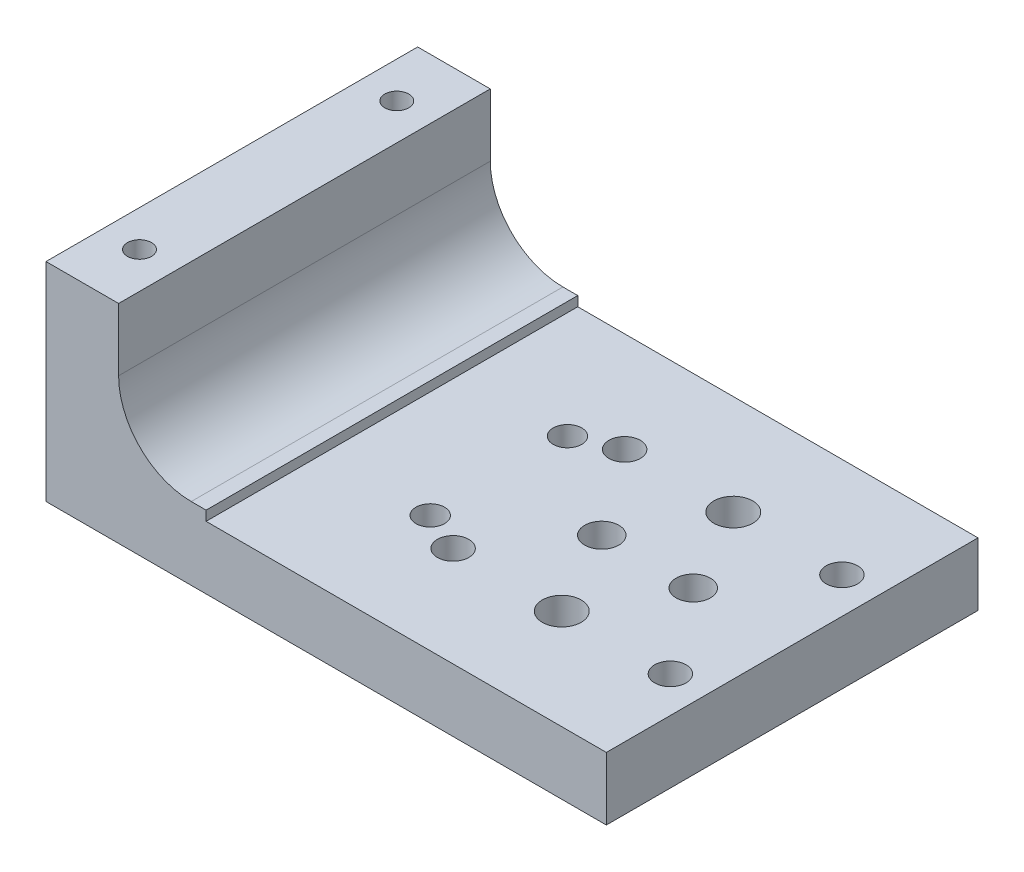
ISO-10303-21;
HEADER;
FILE_DESCRIPTION(('STEP AP214'),'2;1');
FILE_NAME('part.step','',(''),(''),'','','');
FILE_SCHEMA(('AUTOMOTIVE_DESIGN { 1 0 10303 214 1 1 1 1 }'));
ENDSEC;
DATA;
#1=APPLICATION_CONTEXT('core data for automotive mechanical design processes');
#2=APPLICATION_PROTOCOL_DEFINITION('international standard','automotive_design',2000,#1);
#3=PRODUCT_CONTEXT('',#1,'mechanical');
#4=PRODUCT('Part','Part','',(#3));
#5=PRODUCT_RELATED_PRODUCT_CATEGORY('part','',(#4));
#6=PRODUCT_DEFINITION_FORMATION('','',#4);
#7=PRODUCT_DEFINITION_CONTEXT('part definition',#1,'design');
#8=PRODUCT_DEFINITION('design','',#6,#7);
#9=PRODUCT_DEFINITION_SHAPE('','',#8);
#10=(LENGTH_UNIT() NAMED_UNIT(*) SI_UNIT(.MILLI.,.METRE.));
#11=(NAMED_UNIT(*) PLANE_ANGLE_UNIT() SI_UNIT($,.RADIAN.));
#12=(NAMED_UNIT(*) SI_UNIT($,.STERADIAN.) SOLID_ANGLE_UNIT());
#13=UNCERTAINTY_MEASURE_WITH_UNIT(LENGTH_MEASURE(1.E-05),#10,'distance_accuracy_value','');
#14=(GEOMETRIC_REPRESENTATION_CONTEXT(3) GLOBAL_UNCERTAINTY_ASSIGNED_CONTEXT((#13)) GLOBAL_UNIT_ASSIGNED_CONTEXT((#10,
#11,#12)) REPRESENTATION_CONTEXT('',''));
#15=CARTESIAN_POINT('',(0.,0.,0.));
#16=DIRECTION('',(0.,0.,1.));
#17=DIRECTION('',(1.,0.,0.));
#18=AXIS2_PLACEMENT_3D('',#15,#16,#17);
#19=CARTESIAN_POINT('',(0.,0.,32.5));
#20=DIRECTION('',(1.,0.,0.));
#21=DIRECTION('',(0.,0.,-1.));
#22=AXIS2_PLACEMENT_3D('',#19,#20,#21);
#23=PLANE('',#22);
#24=DIRECTION('',(0.,-1.,0.));
#25=VECTOR('',#24,1.);
#26=CARTESIAN_POINT('',(0.,0.,-32.5));
#27=LINE('',#26,#25);
#28=CARTESIAN_POINT('',(0.,36.35,-32.5));
#29=VERTEX_POINT('',#28);
#30=CARTESIAN_POINT('',(0.,0.,-32.5));
#31=VERTEX_POINT('',#30);
#32=EDGE_CURVE('E136',#29,#31,#27,.T.);
#33=ORIENTED_EDGE('',*,*,#32,.T.);
#34=DIRECTION('',(0.,0.,-1.));
#35=VECTOR('',#34,1.);
#36=CARTESIAN_POINT('',(0.,0.,32.5));
#37=LINE('',#36,#35);
#38=CARTESIAN_POINT('',(0.,0.,32.5));
#39=VERTEX_POINT('',#38);
#40=EDGE_CURVE('E11',#39,#31,#37,.T.);
#41=ORIENTED_EDGE('',*,*,#40,.F.);
#42=DIRECTION('',(0.,-1.,0.));
#43=VECTOR('',#42,1.);
#44=CARTESIAN_POINT('',(0.,0.,32.5));
#45=LINE('',#44,#43);
#46=CARTESIAN_POINT('',(0.,36.35,32.5));
#47=VERTEX_POINT('',#46);
#48=EDGE_CURVE('E151',#47,#39,#45,.T.);
#49=ORIENTED_EDGE('',*,*,#48,.F.);
#50=DIRECTION('',(0.,0.,-1.));
#51=VECTOR('',#50,1.);
#52=CARTESIAN_POINT('',(0.,36.35,32.5));
#53=LINE('',#52,#51);
#54=EDGE_CURVE('E132',#47,#29,#53,.T.);
#55=ORIENTED_EDGE('',*,*,#54,.T.);
#56=EDGE_LOOP('',(#33,#41,#49,#55));
#57=FACE_BOUND('',#56,.T.);
#58=ADVANCED_FACE('F39',(#57),#23,.F.);
#59=CARTESIAN_POINT('',(0.,0.,32.5));
#60=DIRECTION('',(0.,1.,0.));
#61=DIRECTION('',(0.,0.,1.));
#62=AXIS2_PLACEMENT_3D('',#59,#60,#61);
#63=PLANE('',#62);
#64=CARTESIAN_POINT('',(64.7,0.,0.));
#65=DIRECTION('',(0.,-1.,0.));
#66=DIRECTION('',(0.,0.,-1.));
#67=AXIS2_PLACEMENT_3D('',#64,#65,#66);
#68=CIRCLE('',#67,2.99999999999999);
#69=CARTESIAN_POINT('',(64.7,0.,-2.99999999999999));
#70=VERTEX_POINT('',#69);
#71=EDGE_CURVE('E340',#70,#70,#68,.T.);
#72=ORIENTED_EDGE('',*,*,#71,.F.);
#73=EDGE_LOOP('',(#72));
#74=FACE_BOUND('',#73,.T.);
#75=CARTESIAN_POINT('',(80.7,0.,0.));
#76=DIRECTION('',(0.,-1.,0.));
#77=DIRECTION('',(0.,0.,-1.));
#78=AXIS2_PLACEMENT_3D('',#75,#76,#77);
#79=CIRCLE('',#78,2.99999999999999);
#80=CARTESIAN_POINT('',(80.7,0.,-2.99999999999999));
#81=VERTEX_POINT('',#80);
#82=EDGE_CURVE('E344',#81,#81,#79,.T.);
#83=ORIENTED_EDGE('',*,*,#82,.F.);
#84=EDGE_LOOP('',(#83));
#85=FACE_BOUND('',#84,.T.);
#86=CARTESIAN_POINT('',(72.7,0.,-14.9999999999999));
#87=DIRECTION('',(0.,-1.,0.));
#88=DIRECTION('',(0.,0.,-1.));
#89=AXIS2_PLACEMENT_3D('',#86,#87,#88);
#90=CIRCLE('',#89,3.39999999999999);
#91=CARTESIAN_POINT('',(72.7,0.,-18.3999999999999));
#92=VERTEX_POINT('',#91);
#93=EDGE_CURVE('E353',#92,#92,#90,.T.);
#94=ORIENTED_EDGE('',*,*,#93,.F.);
#95=EDGE_LOOP('',(#94));
#96=FACE_BOUND('',#95,.T.);
#97=CARTESIAN_POINT('',(72.7,0.,15.0000000000001));
#98=DIRECTION('',(0.,-1.,0.));
#99=DIRECTION('',(0.,0.,-1.));
#100=AXIS2_PLACEMENT_3D('',#97,#98,#99);
#101=CIRCLE('',#100,3.39999999999999);
#102=CARTESIAN_POINT('',(72.7,0.,11.6000000000001));
#103=VERTEX_POINT('',#102);
#104=EDGE_CURVE('E359',#103,#103,#101,.T.);
#105=ORIENTED_EDGE('',*,*,#104,.F.);
#106=EDGE_LOOP('',(#105));
#107=FACE_BOUND('',#106,.T.);
#108=CARTESIAN_POINT('',(46.7000118304876,0.,12.0000000000001));
#109=DIRECTION('',(0.,-1.,0.));
#110=DIRECTION('',(0.,0.,-1.));
#111=AXIS2_PLACEMENT_3D('',#108,#109,#110);
#112=CIRCLE('',#111,2.49999999999999);
#113=CARTESIAN_POINT('',(46.7000118304876,0.,9.50000000000013));
#114=VERTEX_POINT('',#113);
#115=EDGE_CURVE('E365',#114,#114,#112,.T.);
#116=ORIENTED_EDGE('',*,*,#115,.F.);
#117=EDGE_LOOP('',(#116));
#118=FACE_BOUND('',#117,.T.);
#119=CARTESIAN_POINT('',(46.7000118304876,0.,-11.9999999999999));
#120=DIRECTION('',(0.,-1.,0.));
#121=DIRECTION('',(0.,0.,-1.));
#122=AXIS2_PLACEMENT_3D('',#119,#120,#121);
#123=CIRCLE('',#122,2.49999999999999);
#124=CARTESIAN_POINT('',(46.7000118304876,0.,-14.4999999999999));
#125=VERTEX_POINT('',#124);
#126=EDGE_CURVE('E224',#125,#125,#123,.T.);
#127=ORIENTED_EDGE('',*,*,#126,.F.);
#128=EDGE_LOOP('',(#127));
#129=FACE_BOUND('',#128,.T.);
#130=CARTESIAN_POINT('',(53.7,0.,15.0000000000001));
#131=DIRECTION('',(0.,-1.,0.));
#132=DIRECTION('',(0.,0.,-1.));
#133=AXIS2_PLACEMENT_3D('',#130,#131,#132);
#134=CIRCLE('',#133,2.74999999999999);
#135=CARTESIAN_POINT('',(53.7,0.,12.2500000000001));
#136=VERTEX_POINT('',#135);
#137=EDGE_CURVE('E233',#136,#136,#134,.T.);
#138=ORIENTED_EDGE('',*,*,#137,.F.);
#139=EDGE_LOOP('',(#138));
#140=FACE_BOUND('',#139,.T.);
#141=CARTESIAN_POINT('',(91.7,0.,15.0000000000001));
#142=DIRECTION('',(0.,-1.,0.));
#143=DIRECTION('',(0.,0.,-1.));
#144=AXIS2_PLACEMENT_3D('',#141,#142,#143);
#145=CIRCLE('',#144,2.74999999999999);
#146=CARTESIAN_POINT('',(91.7,0.,12.2500000000001));
#147=VERTEX_POINT('',#146);
#148=EDGE_CURVE('E239',#147,#147,#145,.T.);
#149=ORIENTED_EDGE('',*,*,#148,.F.);
#150=EDGE_LOOP('',(#149));
#151=FACE_BOUND('',#150,.T.);
#152=CARTESIAN_POINT('',(91.7,0.,-14.9999999999999));
#153=DIRECTION('',(0.,-1.,0.));
#154=DIRECTION('',(0.,0.,-1.));
#155=AXIS2_PLACEMENT_3D('',#152,#153,#154);
#156=CIRCLE('',#155,2.74999999999999);
#157=CARTESIAN_POINT('',(91.7,0.,-17.7499999999999));
#158=VERTEX_POINT('',#157);
#159=EDGE_CURVE('E245',#158,#158,#156,.T.);
#160=ORIENTED_EDGE('',*,*,#159,.F.);
#161=EDGE_LOOP('',(#160));
#162=FACE_BOUND('',#161,.T.);
#163=CARTESIAN_POINT('',(53.7,0.,-14.9999999999999));
#164=DIRECTION('',(0.,-1.,0.));
#165=DIRECTION('',(0.,0.,-1.));
#166=AXIS2_PLACEMENT_3D('',#163,#164,#165);
#167=CIRCLE('',#166,2.74999999999999);
#168=CARTESIAN_POINT('',(53.7,0.,-17.7499999999999));
#169=VERTEX_POINT('',#168);
#170=EDGE_CURVE('E176',#169,#169,#167,.T.);
#171=ORIENTED_EDGE('',*,*,#170,.F.);
#172=EDGE_LOOP('',(#171));
#173=FACE_BOUND('',#172,.T.);
#174=DIRECTION('',(1.,0.,0.));
#175=VECTOR('',#174,1.);
#176=CARTESIAN_POINT('',(0.,0.,-32.5));
#177=LINE('',#176,#175);
#178=CARTESIAN_POINT('',(98.,0.,-32.5));
#179=VERTEX_POINT('',#178);
#180=EDGE_CURVE('E139',#31,#179,#177,.T.);
#181=ORIENTED_EDGE('',*,*,#180,.T.);
#182=DIRECTION('',(0.,0.,-1.));
#183=VECTOR('',#182,1.);
#184=CARTESIAN_POINT('',(98.,0.,32.5));
#185=LINE('',#184,#183);
#186=CARTESIAN_POINT('',(98.,0.,32.5));
#187=VERTEX_POINT('',#186);
#188=EDGE_CURVE('E46',#187,#179,#185,.T.);
#189=ORIENTED_EDGE('',*,*,#188,.F.);
#190=DIRECTION('',(1.,0.,0.));
#191=VECTOR('',#190,1.);
#192=CARTESIAN_POINT('',(0.,0.,32.5));
#193=LINE('',#192,#191);
#194=EDGE_CURVE('E97',#39,#187,#193,.T.);
#195=ORIENTED_EDGE('',*,*,#194,.F.);
#196=ORIENTED_EDGE('',*,*,#40,.T.);
#197=EDGE_LOOP('',(#181,#189,#195,#196));
#198=FACE_BOUND('',#197,.T.);
#199=ADVANCED_FACE('F258',(#74,#85,#96,#107,#118,#129,#140,#151,#162,#173,#198),#63,.F.);
#200=CARTESIAN_POINT('',(98.,12.7,32.5));
#201=DIRECTION('',(-1.,0.,0.));
#202=DIRECTION('',(0.,0.,1.));
#203=AXIS2_PLACEMENT_3D('',#200,#201,#202);
#204=PLANE('',#203);
#205=DIRECTION('',(0.,1.,0.));
#206=VECTOR('',#205,1.);
#207=CARTESIAN_POINT('',(98.,12.7,-32.5));
#208=LINE('',#207,#206);
#209=CARTESIAN_POINT('',(98.,11.,-32.5));
#210=VERTEX_POINT('',#209);
#211=EDGE_CURVE('E142',#179,#210,#208,.T.);
#212=ORIENTED_EDGE('',*,*,#211,.T.);
#213=DIRECTION('',(0.,0.,-1.));
#214=VECTOR('',#213,1.);
#215=CARTESIAN_POINT('',(98.,11.,32.5));
#216=LINE('',#215,#214);
#217=CARTESIAN_POINT('',(98.,11.,32.5));
#218=VERTEX_POINT('',#217);
#219=EDGE_CURVE('E53',#218,#210,#216,.T.);
#220=ORIENTED_EDGE('',*,*,#219,.F.);
#221=DIRECTION('',(0.,1.,0.));
#222=VECTOR('',#221,1.);
#223=CARTESIAN_POINT('',(98.,12.7,32.5));
#224=LINE('',#223,#222);
#225=EDGE_CURVE('E160',#187,#218,#224,.T.);
#226=ORIENTED_EDGE('',*,*,#225,.F.);
#227=ORIENTED_EDGE('',*,*,#188,.T.);
#228=EDGE_LOOP('',(#212,#220,#226,#227));
#229=FACE_BOUND('',#228,.T.);
#230=ADVANCED_FACE('F158',(#229),#204,.F.);
#231=CARTESIAN_POINT('',(25.4,12.7,32.5));
#232=DIRECTION('',(0.,-1.,0.));
#233=DIRECTION('',(1.,0.,0.));
#234=AXIS2_PLACEMENT_3D('',#231,#232,#233);
#235=PLANE('',#234);
#236=DIRECTION('',(-1.,0.,0.));
#237=VECTOR('',#236,1.);
#238=CARTESIAN_POINT('',(25.4,12.7,32.5));
#239=LINE('',#238,#237);
#240=CARTESIAN_POINT('',(28.,12.7,32.5));
#241=VERTEX_POINT('',#240);
#242=CARTESIAN_POINT('',(25.4,12.7,32.5));
#243=VERTEX_POINT('',#242);
#244=EDGE_CURVE('E115',#241,#243,#239,.T.);
#245=ORIENTED_EDGE('',*,*,#244,.F.);
#246=DIRECTION('',(0.,0.,-1.));
#247=VECTOR('',#246,1.);
#248=CARTESIAN_POINT('',(28.,12.7,32.5));
#249=LINE('',#248,#247);
#250=CARTESIAN_POINT('',(28.,12.7,-32.5));
#251=VERTEX_POINT('',#250);
#252=EDGE_CURVE('E140',#241,#251,#249,.T.);
#253=ORIENTED_EDGE('',*,*,#252,.T.);
#254=DIRECTION('',(-1.,0.,0.));
#255=VECTOR('',#254,1.);
#256=CARTESIAN_POINT('',(25.4,12.7,-32.5));
#257=LINE('',#256,#255);
#258=CARTESIAN_POINT('',(25.4,12.7,-32.5));
#259=VERTEX_POINT('',#258);
#260=EDGE_CURVE('E145',#251,#259,#257,.T.);
#261=ORIENTED_EDGE('',*,*,#260,.T.);
#262=DIRECTION('',(0.,0.,-1.));
#263=VECTOR('',#262,1.);
#264=CARTESIAN_POINT('',(25.4,12.7,32.5));
#265=LINE('',#264,#263);
#266=EDGE_CURVE('E127',#243,#259,#265,.T.);
#267=ORIENTED_EDGE('',*,*,#266,.F.);
#268=EDGE_LOOP('',(#245,#253,#261,#267));
#269=FACE_BOUND('',#268,.T.);
#270=ADVANCED_FACE('F253',(#269),#235,.F.);
#271=CARTESIAN_POINT('',(25.4,25.4,32.5));
#272=DIRECTION('',(0.,0.,-1.));
#273=DIRECTION('',(-1.,0.,0.));
#274=AXIS2_PLACEMENT_3D('',#271,#272,#273);
#275=CYLINDRICAL_SURFACE('',#274,12.7);
#276=CARTESIAN_POINT('',(25.4,25.4,-32.5));
#277=DIRECTION('',(0.,0.,-1.));
#278=DIRECTION('',(1.,0.,0.));
#279=AXIS2_PLACEMENT_3D('',#276,#277,#278);
#280=CIRCLE('',#279,12.7);
#281=CARTESIAN_POINT('',(12.7,25.4,-32.5));
#282=VERTEX_POINT('',#281);
#283=EDGE_CURVE('E124',#259,#282,#280,.T.);
#284=ORIENTED_EDGE('',*,*,#283,.T.);
#285=DIRECTION('',(0.,0.,-1.));
#286=VECTOR('',#285,1.);
#287=CARTESIAN_POINT('',(12.7,25.4,32.5));
#288=LINE('',#287,#286);
#289=CARTESIAN_POINT('',(12.7,25.4,32.5));
#290=VERTEX_POINT('',#289);
#291=EDGE_CURVE('E121',#290,#282,#288,.T.);
#292=ORIENTED_EDGE('',*,*,#291,.F.);
#293=CARTESIAN_POINT('',(25.4,25.4,32.5));
#294=DIRECTION('',(0.,0.,-1.));
#295=DIRECTION('',(1.,0.,0.));
#296=AXIS2_PLACEMENT_3D('',#293,#294,#295);
#297=CIRCLE('',#296,12.7);
#298=EDGE_CURVE('E107',#243,#290,#297,.T.);
#299=ORIENTED_EDGE('',*,*,#298,.F.);
#300=ORIENTED_EDGE('',*,*,#266,.T.);
#301=EDGE_LOOP('',(#284,#292,#299,#300));
#302=FACE_BOUND('',#301,.T.);
#303=ADVANCED_FACE('F122',(#302),#275,.F.);
#304=CARTESIAN_POINT('',(12.7,36.35,32.5));
#305=DIRECTION('',(-1.,0.,0.));
#306=DIRECTION('',(0.,-1.,0.));
#307=AXIS2_PLACEMENT_3D('',#304,#305,#306);
#308=PLANE('',#307);
#309=DIRECTION('',(0.,1.,0.));
#310=VECTOR('',#309,1.);
#311=CARTESIAN_POINT('',(12.7,36.35,-32.5));
#312=LINE('',#311,#310);
#313=CARTESIAN_POINT('',(12.7,36.35,-32.5));
#314=VERTEX_POINT('',#313);
#315=EDGE_CURVE('E148',#282,#314,#312,.T.);
#316=ORIENTED_EDGE('',*,*,#315,.T.);
#317=DIRECTION('',(0.,0.,-1.));
#318=VECTOR('',#317,1.);
#319=CARTESIAN_POINT('',(12.7,36.35,32.5));
#320=LINE('',#319,#318);
#321=CARTESIAN_POINT('',(12.7,36.35,32.5));
#322=VERTEX_POINT('',#321);
#323=EDGE_CURVE('E128',#322,#314,#320,.T.);
#324=ORIENTED_EDGE('',*,*,#323,.F.);
#325=DIRECTION('',(0.,1.,0.));
#326=VECTOR('',#325,1.);
#327=CARTESIAN_POINT('',(12.7,36.35,32.5));
#328=LINE('',#327,#326);
#329=EDGE_CURVE('E112',#290,#322,#328,.T.);
#330=ORIENTED_EDGE('',*,*,#329,.F.);
#331=ORIENTED_EDGE('',*,*,#291,.T.);
#332=EDGE_LOOP('',(#316,#324,#330,#331));
#333=FACE_BOUND('',#332,.T.);
#334=ADVANCED_FACE('F130',(#333),#308,.F.);
#335=CARTESIAN_POINT('',(0.,36.35,32.5));
#336=DIRECTION('',(0.,-1.,0.));
#337=DIRECTION('',(1.,0.,0.));
#338=AXIS2_PLACEMENT_3D('',#335,#336,#337);
#339=PLANE('',#338);
#340=CARTESIAN_POINT('',(6.35000000000001,36.35,22.5));
#341=DIRECTION('',(0.,1.,0.));
#342=DIRECTION('',(0.,0.,1.));
#343=AXIS2_PLACEMENT_3D('',#340,#341,#342);
#344=CIRCLE('',#343,2.09999999999999);
#345=CARTESIAN_POINT('',(6.35000000000001,36.35,24.6));
#346=VERTEX_POINT('',#345);
#347=EDGE_CURVE('E217',#346,#346,#344,.T.);
#348=ORIENTED_EDGE('',*,*,#347,.F.);
#349=EDGE_LOOP('',(#348));
#350=FACE_BOUND('',#349,.T.);
#351=CARTESIAN_POINT('',(6.35000000000001,36.35,-22.5));
#352=DIRECTION('',(0.,1.,0.));
#353=DIRECTION('',(0.,0.,1.));
#354=AXIS2_PLACEMENT_3D('',#351,#352,#353);
#355=CIRCLE('',#354,2.09999999999999);
#356=CARTESIAN_POINT('',(6.35000000000001,36.35,-20.4));
#357=VERTEX_POINT('',#356);
#358=EDGE_CURVE('E230',#357,#357,#355,.T.);
#359=ORIENTED_EDGE('',*,*,#358,.F.);
#360=EDGE_LOOP('',(#359));
#361=FACE_BOUND('',#360,.T.);
#362=DIRECTION('',(-1.,0.,0.));
#363=VECTOR('',#362,1.);
#364=CARTESIAN_POINT('',(0.,36.35,-32.5));
#365=LINE('',#364,#363);
#366=EDGE_CURVE('E89',#314,#29,#365,.T.);
#367=ORIENTED_EDGE('',*,*,#366,.T.);
#368=ORIENTED_EDGE('',*,*,#54,.F.);
#369=DIRECTION('',(-1.,0.,0.));
#370=VECTOR('',#369,1.);
#371=CARTESIAN_POINT('',(0.,36.35,32.5));
#372=LINE('',#371,#370);
#373=EDGE_CURVE('E62',#322,#47,#372,.T.);
#374=ORIENTED_EDGE('',*,*,#373,.F.);
#375=ORIENTED_EDGE('',*,*,#323,.T.);
#376=EDGE_LOOP('',(#367,#368,#374,#375));
#377=FACE_BOUND('',#376,.T.);
#378=ADVANCED_FACE('F254',(#350,#361,#377),#339,.F.);
#379=CARTESIAN_POINT('',(25.4,25.4,32.5));
#380=DIRECTION('',(0.,0.,1.));
#381=DIRECTION('',(1.,0.,0.));
#382=AXIS2_PLACEMENT_3D('',#379,#380,#381);
#383=PLANE('',#382);
#384=DIRECTION('',(0.,1.,0.));
#385=VECTOR('',#384,1.);
#386=CARTESIAN_POINT('',(28.,12.7,32.5));
#387=LINE('',#386,#385);
#388=CARTESIAN_POINT('',(28.,11.,32.5));
#389=VERTEX_POINT('',#388);
#390=EDGE_CURVE('E179',#389,#241,#387,.T.);
#391=ORIENTED_EDGE('',*,*,#390,.T.);
#392=ORIENTED_EDGE('',*,*,#244,.T.);
#393=ORIENTED_EDGE('',*,*,#298,.T.);
#394=ORIENTED_EDGE('',*,*,#329,.T.);
#395=ORIENTED_EDGE('',*,*,#373,.T.);
#396=ORIENTED_EDGE('',*,*,#48,.T.);
#397=ORIENTED_EDGE('',*,*,#194,.T.);
#398=ORIENTED_EDGE('',*,*,#225,.T.);
#399=DIRECTION('',(-1.,0.,0.));
#400=VECTOR('',#399,1.);
#401=CARTESIAN_POINT('',(98.,11.,32.5));
#402=LINE('',#401,#400);
#403=EDGE_CURVE('E173',#218,#389,#402,.T.);
#404=ORIENTED_EDGE('',*,*,#403,.T.);
#405=EDGE_LOOP('',(#391,#392,#393,#394,#395,#396,#397,#398,#404));
#406=FACE_BOUND('',#405,.T.);
#407=ADVANCED_FACE('F110',(#406),#383,.T.);
#408=CARTESIAN_POINT('',(25.4,25.4,-32.5));
#409=DIRECTION('',(0.,0.,1.));
#410=DIRECTION('',(1.,0.,0.));
#411=AXIS2_PLACEMENT_3D('',#408,#409,#410);
#412=PLANE('',#411);
#413=ORIENTED_EDGE('',*,*,#260,.F.);
#414=DIRECTION('',(0.,1.,0.));
#415=VECTOR('',#414,1.);
#416=CARTESIAN_POINT('',(28.,12.7,-32.5));
#417=LINE('',#416,#415);
#418=CARTESIAN_POINT('',(28.,11.,-32.5));
#419=VERTEX_POINT('',#418);
#420=EDGE_CURVE('E169',#419,#251,#417,.T.);
#421=ORIENTED_EDGE('',*,*,#420,.F.);
#422=DIRECTION('',(-1.,0.,0.));
#423=VECTOR('',#422,1.);
#424=CARTESIAN_POINT('',(98.,11.,-32.5));
#425=LINE('',#424,#423);
#426=EDGE_CURVE('E166',#210,#419,#425,.T.);
#427=ORIENTED_EDGE('',*,*,#426,.F.);
#428=ORIENTED_EDGE('',*,*,#211,.F.);
#429=ORIENTED_EDGE('',*,*,#180,.F.);
#430=ORIENTED_EDGE('',*,*,#32,.F.);
#431=ORIENTED_EDGE('',*,*,#366,.F.);
#432=ORIENTED_EDGE('',*,*,#315,.F.);
#433=ORIENTED_EDGE('',*,*,#283,.F.);
#434=EDGE_LOOP('',(#413,#421,#427,#428,#429,#430,#431,#432,#433));
#435=FACE_BOUND('',#434,.T.);
#436=ADVANCED_FACE('F163',(#435),#412,.F.);
#437=CARTESIAN_POINT('',(28.,12.7,32.5));
#438=DIRECTION('',(-1.,0.,0.));
#439=DIRECTION('',(0.,0.,1.));
#440=AXIS2_PLACEMENT_3D('',#437,#438,#439);
#441=PLANE('',#440);
#442=ORIENTED_EDGE('',*,*,#420,.T.);
#443=ORIENTED_EDGE('',*,*,#252,.F.);
#444=ORIENTED_EDGE('',*,*,#390,.F.);
#445=DIRECTION('',(0.,0.,-1.));
#446=VECTOR('',#445,1.);
#447=CARTESIAN_POINT('',(28.,11.,32.5));
#448=LINE('',#447,#446);
#449=EDGE_CURVE('E184',#389,#419,#448,.T.);
#450=ORIENTED_EDGE('',*,*,#449,.T.);
#451=EDGE_LOOP('',(#442,#443,#444,#450));
#452=FACE_BOUND('',#451,.T.);
#453=ADVANCED_FACE('F280',(#452),#441,.F.);
#454=CARTESIAN_POINT('',(98.,11.,32.5));
#455=DIRECTION('',(0.,-1.,0.));
#456=DIRECTION('',(0.,0.,-1.));
#457=AXIS2_PLACEMENT_3D('',#454,#455,#456);
#458=PLANE('',#457);
#459=CARTESIAN_POINT('',(64.7,11.,0.));
#460=DIRECTION('',(0.,-1.,0.));
#461=DIRECTION('',(0.,0.,-1.));
#462=AXIS2_PLACEMENT_3D('',#459,#460,#461);
#463=CIRCLE('',#462,2.99999999999999);
#464=CARTESIAN_POINT('',(64.7,11.,-2.99999999999999));
#465=VERTEX_POINT('',#464);
#466=EDGE_CURVE('E343',#465,#465,#463,.T.);
#467=ORIENTED_EDGE('',*,*,#466,.T.);
#468=EDGE_LOOP('',(#467));
#469=FACE_BOUND('',#468,.T.);
#470=CARTESIAN_POINT('',(80.7,11.,0.));
#471=DIRECTION('',(0.,-1.,0.));
#472=DIRECTION('',(0.,0.,-1.));
#473=AXIS2_PLACEMENT_3D('',#470,#471,#472);
#474=CIRCLE('',#473,2.99999999999999);
#475=CARTESIAN_POINT('',(80.7,11.,-2.99999999999999));
#476=VERTEX_POINT('',#475);
#477=EDGE_CURVE('E347',#476,#476,#474,.T.);
#478=ORIENTED_EDGE('',*,*,#477,.T.);
#479=EDGE_LOOP('',(#478));
#480=FACE_BOUND('',#479,.T.);
#481=CARTESIAN_POINT('',(72.7,11.,-14.9999999999999));
#482=DIRECTION('',(0.,-1.,0.));
#483=DIRECTION('',(0.,0.,-1.));
#484=AXIS2_PLACEMENT_3D('',#481,#482,#483);
#485=CIRCLE('',#484,3.39999999999999);
#486=CARTESIAN_POINT('',(72.7,11.,-18.3999999999999));
#487=VERTEX_POINT('',#486);
#488=EDGE_CURVE('E356',#487,#487,#485,.T.);
#489=ORIENTED_EDGE('',*,*,#488,.T.);
#490=EDGE_LOOP('',(#489));
#491=FACE_BOUND('',#490,.T.);
#492=CARTESIAN_POINT('',(72.7,11.,15.0000000000001));
#493=DIRECTION('',(0.,-1.,0.));
#494=DIRECTION('',(0.,0.,-1.));
#495=AXIS2_PLACEMENT_3D('',#492,#493,#494);
#496=CIRCLE('',#495,3.39999999999999);
#497=CARTESIAN_POINT('',(72.7,11.,11.6000000000001));
#498=VERTEX_POINT('',#497);
#499=EDGE_CURVE('E362',#498,#498,#496,.T.);
#500=ORIENTED_EDGE('',*,*,#499,.T.);
#501=EDGE_LOOP('',(#500));
#502=FACE_BOUND('',#501,.T.);
#503=CARTESIAN_POINT('',(46.7000118304876,11.,12.0000000000001));
#504=DIRECTION('',(0.,-1.,0.));
#505=DIRECTION('',(0.,0.,-1.));
#506=AXIS2_PLACEMENT_3D('',#503,#504,#505);
#507=CIRCLE('',#506,2.49999999999999);
#508=CARTESIAN_POINT('',(46.7000118304876,11.,9.50000000000013));
#509=VERTEX_POINT('',#508);
#510=EDGE_CURVE('E368',#509,#509,#507,.T.);
#511=ORIENTED_EDGE('',*,*,#510,.T.);
#512=EDGE_LOOP('',(#511));
#513=FACE_BOUND('',#512,.T.);
#514=CARTESIAN_POINT('',(46.7000118304876,11.,-11.9999999999999));
#515=DIRECTION('',(0.,-1.,0.));
#516=DIRECTION('',(0.,0.,-1.));
#517=AXIS2_PLACEMENT_3D('',#514,#515,#516);
#518=CIRCLE('',#517,2.49999999999999);
#519=CARTESIAN_POINT('',(46.7000118304876,11.,-14.4999999999999));
#520=VERTEX_POINT('',#519);
#521=EDGE_CURVE('E218',#520,#520,#518,.T.);
#522=ORIENTED_EDGE('',*,*,#521,.T.);
#523=EDGE_LOOP('',(#522));
#524=FACE_BOUND('',#523,.T.);
#525=CARTESIAN_POINT('',(53.7,11.,15.0000000000001));
#526=DIRECTION('',(0.,-1.,0.));
#527=DIRECTION('',(0.,0.,-1.));
#528=AXIS2_PLACEMENT_3D('',#525,#526,#527);
#529=CIRCLE('',#528,2.74999999999999);
#530=CARTESIAN_POINT('',(53.7,11.,12.2500000000001));
#531=VERTEX_POINT('',#530);
#532=EDGE_CURVE('E236',#531,#531,#529,.T.);
#533=ORIENTED_EDGE('',*,*,#532,.T.);
#534=EDGE_LOOP('',(#533));
#535=FACE_BOUND('',#534,.T.);
#536=CARTESIAN_POINT('',(91.7,11.,15.0000000000001));
#537=DIRECTION('',(0.,-1.,0.));
#538=DIRECTION('',(0.,0.,-1.));
#539=AXIS2_PLACEMENT_3D('',#536,#537,#538);
#540=CIRCLE('',#539,2.74999999999999);
#541=CARTESIAN_POINT('',(91.7,11.,12.2500000000001));
#542=VERTEX_POINT('',#541);
#543=EDGE_CURVE('E242',#542,#542,#540,.T.);
#544=ORIENTED_EDGE('',*,*,#543,.T.);
#545=EDGE_LOOP('',(#544));
#546=FACE_BOUND('',#545,.T.);
#547=CARTESIAN_POINT('',(91.7,11.,-14.9999999999999));
#548=DIRECTION('',(0.,-1.,0.));
#549=DIRECTION('',(0.,0.,-1.));
#550=AXIS2_PLACEMENT_3D('',#547,#548,#549);
#551=CIRCLE('',#550,2.74999999999999);
#552=CARTESIAN_POINT('',(91.7,11.,-17.7499999999999));
#553=VERTEX_POINT('',#552);
#554=EDGE_CURVE('E248',#553,#553,#551,.T.);
#555=ORIENTED_EDGE('',*,*,#554,.T.);
#556=EDGE_LOOP('',(#555));
#557=FACE_BOUND('',#556,.T.);
#558=CARTESIAN_POINT('',(53.7,11.,-14.9999999999999));
#559=DIRECTION('',(0.,-1.,0.));
#560=DIRECTION('',(0.,0.,-1.));
#561=AXIS2_PLACEMENT_3D('',#558,#559,#560);
#562=CIRCLE('',#561,2.74999999999999);
#563=CARTESIAN_POINT('',(53.7,11.,-17.7499999999999));
#564=VERTEX_POINT('',#563);
#565=EDGE_CURVE('E171',#564,#564,#562,.T.);
#566=ORIENTED_EDGE('',*,*,#565,.T.);
#567=EDGE_LOOP('',(#566));
#568=FACE_BOUND('',#567,.T.);
#569=ORIENTED_EDGE('',*,*,#426,.T.);
#570=ORIENTED_EDGE('',*,*,#449,.F.);
#571=ORIENTED_EDGE('',*,*,#403,.F.);
#572=ORIENTED_EDGE('',*,*,#219,.T.);
#573=EDGE_LOOP('',(#569,#570,#571,#572));
#574=FACE_BOUND('',#573,.T.);
#575=ADVANCED_FACE('F283',(#469,#480,#491,#502,#513,#524,#535,#546,#557,#568,#574),#458,.F.);
#576=CARTESIAN_POINT('',(53.7,0.,-14.9999999999999));
#577=DIRECTION('',(0.,-1.,0.));
#578=DIRECTION('',(0.,0.,-1.));
#579=AXIS2_PLACEMENT_3D('',#576,#577,#578);
#580=CYLINDRICAL_SURFACE('',#579,2.74999999999999);
#581=ORIENTED_EDGE('',*,*,#170,.T.);
#582=EDGE_LOOP('',(#581));
#583=FACE_BOUND('',#582,.T.);
#584=ORIENTED_EDGE('',*,*,#565,.F.);
#585=EDGE_LOOP('',(#584));
#586=FACE_BOUND('',#585,.T.);
#587=ADVANCED_FACE('F286',(#583,#586),#580,.F.);
#588=CARTESIAN_POINT('',(91.7,0.,-14.9999999999999));
#589=DIRECTION('',(0.,-1.,0.));
#590=DIRECTION('',(0.,0.,-1.));
#591=AXIS2_PLACEMENT_3D('',#588,#589,#590);
#592=CYLINDRICAL_SURFACE('',#591,2.74999999999999);
#593=ORIENTED_EDGE('',*,*,#159,.T.);
#594=EDGE_LOOP('',(#593));
#595=FACE_BOUND('',#594,.T.);
#596=ORIENTED_EDGE('',*,*,#554,.F.);
#597=EDGE_LOOP('',(#596));
#598=FACE_BOUND('',#597,.T.);
#599=ADVANCED_FACE('F292',(#595,#598),#592,.F.);
#600=CARTESIAN_POINT('',(91.7,0.,15.0000000000001));
#601=DIRECTION('',(0.,-1.,0.));
#602=DIRECTION('',(0.,0.,-1.));
#603=AXIS2_PLACEMENT_3D('',#600,#601,#602);
#604=CYLINDRICAL_SURFACE('',#603,2.74999999999999);
#605=ORIENTED_EDGE('',*,*,#148,.T.);
#606=EDGE_LOOP('',(#605));
#607=FACE_BOUND('',#606,.T.);
#608=ORIENTED_EDGE('',*,*,#543,.F.);
#609=EDGE_LOOP('',(#608));
#610=FACE_BOUND('',#609,.T.);
#611=ADVANCED_FACE('F296',(#607,#610),#604,.F.);
#612=CARTESIAN_POINT('',(53.7,0.,15.0000000000001));
#613=DIRECTION('',(0.,-1.,0.));
#614=DIRECTION('',(0.,0.,-1.));
#615=AXIS2_PLACEMENT_3D('',#612,#613,#614);
#616=CYLINDRICAL_SURFACE('',#615,2.74999999999999);
#617=ORIENTED_EDGE('',*,*,#137,.T.);
#618=EDGE_LOOP('',(#617));
#619=FACE_BOUND('',#618,.T.);
#620=ORIENTED_EDGE('',*,*,#532,.F.);
#621=EDGE_LOOP('',(#620));
#622=FACE_BOUND('',#621,.T.);
#623=ADVANCED_FACE('F300',(#619,#622),#616,.F.);
#624=CARTESIAN_POINT('',(6.35000000000001,36.35,-22.5));
#625=DIRECTION('',(0.,1.,0.));
#626=DIRECTION('',(0.,0.,1.));
#627=AXIS2_PLACEMENT_3D('',#624,#625,#626);
#628=CYLINDRICAL_SURFACE('',#627,2.09999999999999);
#629=CARTESIAN_POINT('',(6.35000000000001,17.3,-22.5));
#630=DIRECTION('',(0.,1.,0.));
#631=DIRECTION('',(0.,0.,1.));
#632=AXIS2_PLACEMENT_3D('',#629,#630,#631);
#633=CIRCLE('',#632,2.09999999999999);
#634=CARTESIAN_POINT('',(6.35000000000001,17.3,-20.4));
#635=VERTEX_POINT('',#634);
#636=EDGE_CURVE('E221',#635,#635,#633,.T.);
#637=ORIENTED_EDGE('',*,*,#636,.F.);
#638=EDGE_LOOP('',(#637));
#639=FACE_BOUND('',#638,.T.);
#640=ORIENTED_EDGE('',*,*,#358,.T.);
#641=EDGE_LOOP('',(#640));
#642=FACE_BOUND('',#641,.T.);
#643=ADVANCED_FACE('F304',(#639,#642),#628,.F.);
#644=CARTESIAN_POINT('',(6.35000000000001,17.3,-22.5));
#645=DIRECTION('',(0.,1.,0.));
#646=DIRECTION('',(0.,0.,1.));
#647=AXIS2_PLACEMENT_3D('',#644,#645,#646);
#648=CONICAL_SURFACE('',#647,2.09999999999999,1.02974425867665);
#649=CARTESIAN_POINT('',(6.35,16.0381927000421,-22.5));
#650=VERTEX_POINT('',#649);
#651=VERTEX_LOOP('',#650);
#652=FACE_BOUND('',#651,.T.);
#653=ORIENTED_EDGE('',*,*,#636,.T.);
#654=EDGE_LOOP('',(#653));
#655=FACE_BOUND('',#654,.T.);
#656=ADVANCED_FACE('F308',(#652,#655),#648,.F.);
#657=CARTESIAN_POINT('',(6.35000000000001,36.35,22.5));
#658=DIRECTION('',(0.,1.,0.));
#659=DIRECTION('',(0.,0.,1.));
#660=AXIS2_PLACEMENT_3D('',#657,#658,#659);
#661=CYLINDRICAL_SURFACE('',#660,2.09999999999999);
#662=CARTESIAN_POINT('',(6.35000000000001,17.3,22.5));
#663=DIRECTION('',(0.,1.,0.));
#664=DIRECTION('',(0.,0.,1.));
#665=AXIS2_PLACEMENT_3D('',#662,#663,#664);
#666=CIRCLE('',#665,2.09999999999999);
#667=CARTESIAN_POINT('',(6.35000000000001,17.3,24.6));
#668=VERTEX_POINT('',#667);
#669=EDGE_CURVE('E215',#668,#668,#666,.T.);
#670=ORIENTED_EDGE('',*,*,#669,.F.);
#671=EDGE_LOOP('',(#670));
#672=FACE_BOUND('',#671,.T.);
#673=ORIENTED_EDGE('',*,*,#347,.T.);
#674=EDGE_LOOP('',(#673));
#675=FACE_BOUND('',#674,.T.);
#676=ADVANCED_FACE('F211',(#672,#675),#661,.F.);
#677=CARTESIAN_POINT('',(6.35000000000001,17.3,22.5));
#678=DIRECTION('',(0.,1.,0.));
#679=DIRECTION('',(0.,0.,1.));
#680=AXIS2_PLACEMENT_3D('',#677,#678,#679);
#681=CONICAL_SURFACE('',#680,2.09999999999999,1.02974425867665);
#682=CARTESIAN_POINT('',(6.35000000000001,16.0381927000421,22.5));
#683=VERTEX_POINT('',#682);
#684=VERTEX_LOOP('',#683);
#685=FACE_BOUND('',#684,.T.);
#686=ORIENTED_EDGE('',*,*,#669,.T.);
#687=EDGE_LOOP('',(#686));
#688=FACE_BOUND('',#687,.T.);
#689=ADVANCED_FACE('F207',(#685,#688),#681,.F.);
#690=CARTESIAN_POINT('',(46.7000118304876,0.,-11.9999999999999));
#691=DIRECTION('',(0.,-1.,0.));
#692=DIRECTION('',(0.,0.,-1.));
#693=AXIS2_PLACEMENT_3D('',#690,#691,#692);
#694=CYLINDRICAL_SURFACE('',#693,2.49999999999999);
#695=ORIENTED_EDGE('',*,*,#126,.T.);
#696=EDGE_LOOP('',(#695));
#697=FACE_BOUND('',#696,.T.);
#698=ORIENTED_EDGE('',*,*,#521,.F.);
#699=EDGE_LOOP('',(#698));
#700=FACE_BOUND('',#699,.T.);
#701=ADVANCED_FACE('F210',(#697,#700),#694,.F.);
#702=CARTESIAN_POINT('',(46.7000118304876,0.,12.0000000000001));
#703=DIRECTION('',(0.,-1.,0.));
#704=DIRECTION('',(0.,0.,-1.));
#705=AXIS2_PLACEMENT_3D('',#702,#703,#704);
#706=CYLINDRICAL_SURFACE('',#705,2.49999999999999);
#707=ORIENTED_EDGE('',*,*,#115,.T.);
#708=EDGE_LOOP('',(#707));
#709=FACE_BOUND('',#708,.T.);
#710=ORIENTED_EDGE('',*,*,#510,.F.);
#711=EDGE_LOOP('',(#710));
#712=FACE_BOUND('',#711,.T.);
#713=ADVANCED_FACE('F316',(#709,#712),#706,.F.);
#714=CARTESIAN_POINT('',(72.7,0.,15.0000000000001));
#715=DIRECTION('',(0.,-1.,0.));
#716=DIRECTION('',(0.,0.,-1.));
#717=AXIS2_PLACEMENT_3D('',#714,#715,#716);
#718=CYLINDRICAL_SURFACE('',#717,3.39999999999999);
#719=ORIENTED_EDGE('',*,*,#104,.T.);
#720=EDGE_LOOP('',(#719));
#721=FACE_BOUND('',#720,.T.);
#722=ORIENTED_EDGE('',*,*,#499,.F.);
#723=EDGE_LOOP('',(#722));
#724=FACE_BOUND('',#723,.T.);
#725=ADVANCED_FACE('F320',(#721,#724),#718,.F.);
#726=CARTESIAN_POINT('',(72.7,0.,-14.9999999999999));
#727=DIRECTION('',(0.,-1.,0.));
#728=DIRECTION('',(0.,0.,-1.));
#729=AXIS2_PLACEMENT_3D('',#726,#727,#728);
#730=CYLINDRICAL_SURFACE('',#729,3.39999999999999);
#731=ORIENTED_EDGE('',*,*,#93,.T.);
#732=EDGE_LOOP('',(#731));
#733=FACE_BOUND('',#732,.T.);
#734=ORIENTED_EDGE('',*,*,#488,.F.);
#735=EDGE_LOOP('',(#734));
#736=FACE_BOUND('',#735,.T.);
#737=ADVANCED_FACE('F324',(#733,#736),#730,.F.);
#738=CARTESIAN_POINT('',(80.7,0.,0.));
#739=DIRECTION('',(0.,-1.,0.));
#740=DIRECTION('',(0.,0.,-1.));
#741=AXIS2_PLACEMENT_3D('',#738,#739,#740);
#742=CYLINDRICAL_SURFACE('',#741,2.99999999999999);
#743=ORIENTED_EDGE('',*,*,#82,.T.);
#744=EDGE_LOOP('',(#743));
#745=FACE_BOUND('',#744,.T.);
#746=ORIENTED_EDGE('',*,*,#477,.F.);
#747=EDGE_LOOP('',(#746));
#748=FACE_BOUND('',#747,.T.);
#749=ADVANCED_FACE('F328',(#745,#748),#742,.F.);
#750=CARTESIAN_POINT('',(64.7,0.,0.));
#751=DIRECTION('',(0.,-1.,0.));
#752=DIRECTION('',(0.,0.,-1.));
#753=AXIS2_PLACEMENT_3D('',#750,#751,#752);
#754=CYLINDRICAL_SURFACE('',#753,2.99999999999999);
#755=ORIENTED_EDGE('',*,*,#71,.T.);
#756=EDGE_LOOP('',(#755));
#757=FACE_BOUND('',#756,.T.);
#758=ORIENTED_EDGE('',*,*,#466,.F.);
#759=EDGE_LOOP('',(#758));
#760=FACE_BOUND('',#759,.T.);
#761=ADVANCED_FACE('F332',(#757,#760),#754,.F.);
#762=CLOSED_SHELL('',(#58,#199,#230,#270,#303,#334,#378,#407,#436,#453,#575,#587,#599,#611,#623,
#643,#656,#676,#689,#701,#713,#725,#737,#749,#761));
#763=MANIFOLD_SOLID_BREP('B2',#762);
#764=ADVANCED_BREP_SHAPE_REPRESENTATION('',(#18,#763),#14);
#765=SHAPE_DEFINITION_REPRESENTATION(#9,#764);
ENDSEC;
END-ISO-10303-21;
